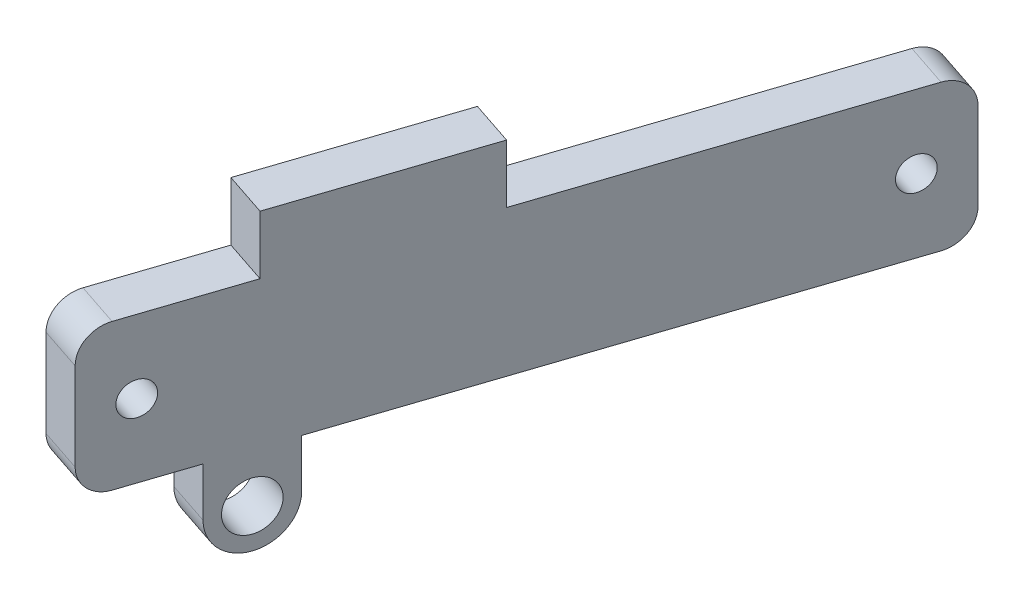
ISO-10303-21;
HEADER;
FILE_DESCRIPTION(('STEP AP214'),'2;1');
FILE_NAME('part.step','',(''),(''),'','','');
FILE_SCHEMA(('AUTOMOTIVE_DESIGN { 1 0 10303 214 1 1 1 1 }'));
ENDSEC;
DATA;
#1=APPLICATION_CONTEXT('core data for automotive mechanical design processes');
#2=APPLICATION_PROTOCOL_DEFINITION('international standard','automotive_design',2000,#1);
#3=PRODUCT_CONTEXT('',#1,'mechanical');
#4=PRODUCT('Part','Part','',(#3));
#5=PRODUCT_RELATED_PRODUCT_CATEGORY('part','',(#4));
#6=PRODUCT_DEFINITION_FORMATION('','',#4);
#7=PRODUCT_DEFINITION_CONTEXT('part definition',#1,'design');
#8=PRODUCT_DEFINITION('design','',#6,#7);
#9=PRODUCT_DEFINITION_SHAPE('','',#8);
#10=(LENGTH_UNIT() NAMED_UNIT(*) SI_UNIT(.MILLI.,.METRE.));
#11=(NAMED_UNIT(*) PLANE_ANGLE_UNIT() SI_UNIT($,.RADIAN.));
#12=(NAMED_UNIT(*) SI_UNIT($,.STERADIAN.) SOLID_ANGLE_UNIT());
#13=UNCERTAINTY_MEASURE_WITH_UNIT(LENGTH_MEASURE(1.E-05),#10,'distance_accuracy_value','');
#14=(GEOMETRIC_REPRESENTATION_CONTEXT(3) GLOBAL_UNCERTAINTY_ASSIGNED_CONTEXT((#13)) GLOBAL_UNIT_ASSIGNED_CONTEXT((#10,
#11,#12)) REPRESENTATION_CONTEXT('',''));
#15=CARTESIAN_POINT('',(0.,0.,0.));
#16=DIRECTION('',(0.,0.,1.));
#17=DIRECTION('',(1.,0.,0.));
#18=AXIS2_PLACEMENT_3D('',#15,#16,#17);
#19=CARTESIAN_POINT('',(-42.954096208357,238.125,-71.1245443554342));
#20=DIRECTION('',(0.,1.,0.));
#21=DIRECTION('',(0.,0.,1.));
#22=AXIS2_PLACEMENT_3D('',#19,#20,#21);
#23=PLANE('',#22);
#24=DIRECTION('',(-0.948683298050514,0.,-0.316227766016838));
#25=VECTOR('',#24,1.);
#26=CARTESIAN_POINT('',(-6.08031467214316,238.125,-78.9137469854321));
#27=LINE('',#26,#25);
#28=CARTESIAN_POINT('',(-31.2378574774332,238.125,-87.2995945871955));
#29=VERTEX_POINT('',#28);
#30=CARTESIAN_POINT('',(-36.9299572657363,238.125,-89.1969611832965));
#31=VERTEX_POINT('',#30);
#32=EDGE_CURVE('E50',#29,#31,#27,.T.);
#33=ORIENTED_EDGE('',*,*,#32,.T.);
#34=DIRECTION('',(-0.316227766016838,0.,0.948683298050514));
#35=VECTOR('',#34,1.);
#36=CARTESIAN_POINT('',(-42.954096208357,238.125,-71.1245443554342));
#37=LINE('',#36,#35);
#38=CARTESIAN_POINT('',(-41.7492684198329,238.125,-74.7390277210066));
#39=VERTEX_POINT('',#38);
#40=EDGE_CURVE('E240',#31,#39,#37,.T.);
#41=ORIENTED_EDGE('',*,*,#40,.T.);
#42=DIRECTION('',(0.948683298050514,0.,0.316227766016838));
#43=VECTOR('',#42,1.);
#44=CARTESIAN_POINT('',(-41.7492684198329,238.125,-74.7390277210066));
#45=LINE('',#44,#43);
#46=CARTESIAN_POINT('',(-36.0571686315298,238.125,-72.8416611249056));
#47=VERTEX_POINT('',#46);
#48=EDGE_CURVE('E283',#39,#47,#45,.T.);
#49=ORIENTED_EDGE('',*,*,#48,.T.);
#50=DIRECTION('',(-0.316227766016838,0.,0.948683298050514));
#51=VECTOR('',#50,1.);
#52=CARTESIAN_POINT('',(-37.2619964200539,238.125,-69.2271777593332));
#53=LINE('',#52,#51);
#54=EDGE_CURVE('E253',#29,#47,#53,.T.);
#55=ORIENTED_EDGE('',*,*,#54,.F.);
#56=EDGE_LOOP('',(#33,#41,#49,#55));
#57=FACE_BOUND('',#56,.T.);
#58=ADVANCED_FACE('F35',(#57),#23,.T.);
#59=CARTESIAN_POINT('',(-42.954096208357,219.075,-71.1245443554342));
#60=DIRECTION('',(0.,-1.,0.));
#61=DIRECTION('',(0.,0.,-1.));
#62=AXIS2_PLACEMENT_3D('',#59,#60,#61);
#63=PLANE('',#62);
#64=DIRECTION('',(-0.948683298050514,0.,-0.316227766016838));
#65=VECTOR('',#64,1.);
#66=CARTESIAN_POINT('',(-18.5872525514053,219.075,-76.8912501430432));
#67=LINE('',#66,#65);
#68=CARTESIAN_POINT('',(-33.0953003180761,219.075,-81.7272660652668));
#69=VERTEX_POINT('',#68);
#70=CARTESIAN_POINT('',(-38.7874001063791,219.075,-83.6246326613679));
#71=VERTEX_POINT('',#70);
#72=EDGE_CURVE('E209',#69,#71,#67,.T.);
#73=ORIENTED_EDGE('',*,*,#72,.F.);
#74=DIRECTION('',(0.316227766016838,0.,-0.948683298050514));
#75=VECTOR('',#74,1.);
#76=CARTESIAN_POINT('',(-37.2619964200539,219.075,-69.2271777593332));
#77=LINE('',#76,#75);
#78=CARTESIAN_POINT('',(-36.0571686315298,219.075,-72.8416611249056));
#79=VERTEX_POINT('',#78);
#80=EDGE_CURVE('E247',#79,#69,#77,.T.);
#81=ORIENTED_EDGE('',*,*,#80,.F.);
#82=DIRECTION('',(0.948683298050514,0.,0.316227766016838));
#83=VECTOR('',#82,1.);
#84=CARTESIAN_POINT('',(-41.7492684198329,219.075,-74.7390277210066));
#85=LINE('',#84,#83);
#86=CARTESIAN_POINT('',(-41.7492684198329,219.075,-74.7390277210066));
#87=VERTEX_POINT('',#86);
#88=EDGE_CURVE('E243',#79,#87,#85,.F.);
#89=ORIENTED_EDGE('',*,*,#88,.T.);
#90=DIRECTION('',(0.316227766016838,0.,-0.948683298050514));
#91=VECTOR('',#90,1.);
#92=CARTESIAN_POINT('',(-42.954096208357,219.075,-71.1245443554342));
#93=LINE('',#92,#91);
#94=EDGE_CURVE('E234',#87,#71,#93,.T.);
#95=ORIENTED_EDGE('',*,*,#94,.T.);
#96=EDGE_LOOP('',(#73,#81,#89,#95));
#97=FACE_BOUND('',#96,.T.);
#98=ADVANCED_FACE('F319',(#97),#63,.T.);
#99=CARTESIAN_POINT('',(-42.954096208357,238.125,-71.1245443554342));
#100=DIRECTION('',(-0.316227766016838,0.,0.948683298050514));
#101=DIRECTION('',(0.948683298050514,0.,0.316227766016838));
#102=AXIS2_PLACEMENT_3D('',#99,#100,#101);
#103=PLANE('',#102);
#104=DIRECTION('',(0.,-1.,0.));
#105=VECTOR('',#104,1.);
#106=CARTESIAN_POINT('',(-42.954096208357,238.125,-71.1245443554342));
#107=LINE('',#106,#105);
#108=CARTESIAN_POINT('',(-42.954096208357,234.315,-71.1245443554342));
#109=VERTEX_POINT('',#108);
#110=CARTESIAN_POINT('',(-42.954096208357,222.885,-71.1245443554342));
#111=VERTEX_POINT('',#110);
#112=EDGE_CURVE('E229',#109,#111,#107,.T.);
#113=ORIENTED_EDGE('',*,*,#112,.T.);
#114=DIRECTION('',(0.948683298050514,0.,0.316227766016838));
#115=VECTOR('',#114,1.);
#116=CARTESIAN_POINT('',(-42.954096208357,222.885,-71.1245443554342));
#117=LINE('',#116,#115);
#118=CARTESIAN_POINT('',(-37.2619964200539,222.885,-69.2271777593332));
#119=VERTEX_POINT('',#118);
#120=EDGE_CURVE('E11',#111,#119,#117,.T.);
#121=ORIENTED_EDGE('',*,*,#120,.T.);
#122=DIRECTION('',(0.,-1.,0.));
#123=VECTOR('',#122,1.);
#124=CARTESIAN_POINT('',(-37.2619964200539,238.125,-69.2271777593332));
#125=LINE('',#124,#123);
#126=CARTESIAN_POINT('',(-37.2619964200539,234.315,-69.2271777593332));
#127=VERTEX_POINT('',#126);
#128=EDGE_CURVE('E226',#127,#119,#125,.T.);
#129=ORIENTED_EDGE('',*,*,#128,.F.);
#130=DIRECTION('',(0.948683298050514,0.,0.316227766016838));
#131=VECTOR('',#130,1.);
#132=CARTESIAN_POINT('',(-42.954096208357,234.315,-71.1245443554342));
#133=LINE('',#132,#131);
#134=EDGE_CURVE('E43',#127,#109,#133,.F.);
#135=ORIENTED_EDGE('',*,*,#134,.T.);
#136=EDGE_LOOP('',(#113,#121,#129,#135));
#137=FACE_BOUND('',#136,.T.);
#138=ADVANCED_FACE('F291',(#137),#103,.T.);
#139=DIRECTION('',(-0.948683298050514,0.,-0.316227766016838));
#140=VECTOR('',#139,1.);
#141=CARTESIAN_POINT('',(1.95187058468453,238.125,-103.010302755915));
#142=LINE('',#141,#140);
#143=CARTESIAN_POINT('',(-23.2056722206055,238.125,-111.396150357679));
#144=VERTEX_POINT('',#143);
#145=CARTESIAN_POINT('',(-28.8977720089086,238.125,-113.29351695378));
#146=VERTEX_POINT('',#145);
#147=EDGE_CURVE('E165',#144,#146,#142,.T.);
#148=ORIENTED_EDGE('',*,*,#147,.F.);
#149=CARTESIAN_POINT('',(-9.05073158016573,238.125,-153.860972278998));
#150=VERTEX_POINT('',#149);
#151=EDGE_CURVE('E233',#150,#144,#53,.T.);
#152=ORIENTED_EDGE('',*,*,#151,.F.);
#153=DIRECTION('',(0.948683298050514,0.,0.316227766016838));
#154=VECTOR('',#153,1.);
#155=CARTESIAN_POINT('',(-14.7428313684688,238.125,-155.758338875099));
#156=LINE('',#155,#154);
#157=CARTESIAN_POINT('',(-14.7428313684688,238.125,-155.758338875099));
#158=VERTEX_POINT('',#157);
#159=EDGE_CURVE('E286',#150,#158,#156,.F.);
#160=ORIENTED_EDGE('',*,*,#159,.T.);
#161=EDGE_CURVE('E241',#158,#146,#37,.T.);
#162=ORIENTED_EDGE('',*,*,#161,.T.);
#163=EDGE_LOOP('',(#148,#152,#160,#162));
#164=FACE_BOUND('',#163,.T.);
#165=ADVANCED_FACE('F321',(#164),#23,.T.);
#166=CARTESIAN_POINT('',(-13.5380035799447,238.125,-159.372822240671));
#167=DIRECTION('',(0.316227766016838,0.,-0.948683298050514));
#168=DIRECTION('',(-0.948683298050514,0.,-0.316227766016838));
#169=AXIS2_PLACEMENT_3D('',#166,#167,#168);
#170=PLANE('',#169);
#171=DIRECTION('',(0.,1.,0.));
#172=VECTOR('',#171,1.);
#173=CARTESIAN_POINT('',(-7.84590379164158,238.125,-157.47545564457));
#174=LINE('',#173,#172);
#175=CARTESIAN_POINT('',(-7.84590379164158,222.885,-157.47545564457));
#176=VERTEX_POINT('',#175);
#177=CARTESIAN_POINT('',(-7.84590379164158,234.315,-157.47545564457));
#178=VERTEX_POINT('',#177);
#179=EDGE_CURVE('E250',#176,#178,#174,.T.);
#180=ORIENTED_EDGE('',*,*,#179,.F.);
#181=DIRECTION('',(0.948683298050514,0.,0.316227766016838));
#182=VECTOR('',#181,1.);
#183=CARTESIAN_POINT('',(-13.5380035799447,222.885,-159.372822240671));
#184=LINE('',#183,#182);
#185=CARTESIAN_POINT('',(-13.5380035799447,222.885,-159.372822240671));
#186=VERTEX_POINT('',#185);
#187=EDGE_CURVE('E271',#176,#186,#184,.F.);
#188=ORIENTED_EDGE('',*,*,#187,.T.);
#189=DIRECTION('',(0.,1.,0.));
#190=VECTOR('',#189,1.);
#191=CARTESIAN_POINT('',(-13.5380035799447,238.125,-159.372822240671));
#192=LINE('',#191,#190);
#193=CARTESIAN_POINT('',(-13.5380035799447,234.315,-159.372822240671));
#194=VERTEX_POINT('',#193);
#195=EDGE_CURVE('E237',#186,#194,#192,.T.);
#196=ORIENTED_EDGE('',*,*,#195,.T.);
#197=DIRECTION('',(0.948683298050514,0.,0.316227766016838));
#198=VECTOR('',#197,1.);
#199=CARTESIAN_POINT('',(-13.5380035799447,234.315,-159.372822240671));
#200=LINE('',#199,#198);
#201=EDGE_CURVE('E268',#194,#178,#200,.T.);
#202=ORIENTED_EDGE('',*,*,#201,.T.);
#203=EDGE_LOOP('',(#180,#188,#196,#202));
#204=FACE_BOUND('',#203,.T.);
#205=ADVANCED_FACE('F332',(#204),#170,.T.);
#206=DIRECTION('',(-0.948683298050514,0.,-0.316227766016838));
#207=VECTOR('',#206,1.);
#208=CARTESIAN_POINT('',(-15.3743784486742,219.075,-86.5298724512365));
#209=LINE('',#208,#207);
#210=CARTESIAN_POINT('',(-29.882426215345,219.075,-91.3658883734601));
#211=VERTEX_POINT('',#210);
#212=CARTESIAN_POINT('',(-35.5745260036481,219.075,-93.2632549695611));
#213=VERTEX_POINT('',#212);
#214=EDGE_CURVE('E58',#211,#213,#209,.T.);
#215=ORIENTED_EDGE('',*,*,#214,.T.);
#216=CARTESIAN_POINT('',(-14.7428313684688,219.075,-155.758338875099));
#217=VERTEX_POINT('',#216);
#218=EDGE_CURVE('E232',#213,#217,#93,.T.);
#219=ORIENTED_EDGE('',*,*,#218,.T.);
#220=DIRECTION('',(0.948683298050514,0.,0.316227766016838));
#221=VECTOR('',#220,1.);
#222=CARTESIAN_POINT('',(-14.7428313684688,219.075,-155.758338875099));
#223=LINE('',#222,#221);
#224=CARTESIAN_POINT('',(-9.05073158016572,219.075,-153.860972278998));
#225=VERTEX_POINT('',#224);
#226=EDGE_CURVE('E257',#217,#225,#223,.T.);
#227=ORIENTED_EDGE('',*,*,#226,.T.);
#228=EDGE_CURVE('E246',#211,#225,#77,.T.);
#229=ORIENTED_EDGE('',*,*,#228,.F.);
#230=EDGE_LOOP('',(#215,#219,#227,#229));
#231=FACE_BOUND('',#230,.T.);
#232=ADVANCED_FACE('F329',(#231),#63,.T.);
#233=CARTESIAN_POINT('',(-59.9960498941516,0.,-19.9986832980505));
#234=DIRECTION('',(0.948683298050514,0.,0.316227766016838));
#235=DIRECTION('',(0.316227766016838,0.,-0.948683298050514));
#236=AXIS2_PLACEMENT_3D('',#233,#234,#235);
#237=PLANE('',#236);
#238=CARTESIAN_POINT('',(-40.9460498941516,228.6,-77.1486832980505));
#239=DIRECTION('',(0.948683298050514,0.,0.316227766016838));
#240=DIRECTION('',(0.316227766016838,0.,-0.948683298050514));
#241=AXIS2_PLACEMENT_3D('',#238,#239,#240);
#242=CIRCLE('',#241,2.15265000000001);
#243=CARTESIAN_POINT('',(-40.2653221936354,228.6,-79.190866399599));
#244=VERTEX_POINT('',#243);
#245=EDGE_CURVE('E217',#244,#244,#242,.T.);
#246=ORIENTED_EDGE('',*,*,#245,.T.);
#247=EDGE_LOOP('',(#246));
#248=FACE_BOUND('',#247,.T.);
#249=CARTESIAN_POINT('',(-15.5460498941516,228.6,-153.348683298051));
#250=DIRECTION('',(0.948683298050514,0.,0.316227766016838));
#251=DIRECTION('',(0.316227766016838,0.,-0.948683298050514));
#252=AXIS2_PLACEMENT_3D('',#249,#250,#251);
#253=CIRCLE('',#252,2.15265);
#254=CARTESIAN_POINT('',(-14.8653221936354,228.6,-155.390866399599));
#255=VERTEX_POINT('',#254);
#256=EDGE_CURVE('E223',#255,#255,#253,.T.);
#257=ORIENTED_EDGE('',*,*,#256,.T.);
#258=EDGE_LOOP('',(#257));
#259=FACE_BOUND('',#258,.T.);
#260=ORIENTED_EDGE('',*,*,#195,.F.);
#261=CARTESIAN_POINT('',(-14.7428313684688,222.885,-155.758338875099));
#262=DIRECTION('',(0.948683298050514,0.,0.316227766016838));
#263=DIRECTION('',(0.316227766016838,0.,-0.948683298050514));
#264=AXIS2_PLACEMENT_3D('',#261,#262,#263);
#265=CIRCLE('',#264,3.81);
#266=EDGE_CURVE('E280',#186,#217,#265,.F.);
#267=ORIENTED_EDGE('',*,*,#266,.T.);
#268=ORIENTED_EDGE('',*,*,#218,.F.);
#269=DIRECTION('',(0.,-1.,0.));
#270=VECTOR('',#269,1.);
#271=CARTESIAN_POINT('',(-35.5745260036481,219.075,-93.2632549695611));
#272=LINE('',#271,#270);
#273=CARTESIAN_POINT('',(-35.5745260036481,212.725,-93.2632549695611));
#274=VERTEX_POINT('',#273);
#275=EDGE_CURVE('E194',#213,#274,#272,.T.);
#276=ORIENTED_EDGE('',*,*,#275,.T.);
#277=CARTESIAN_POINT('',(-37.1809630550136,212.725,-88.4439438154645));
#278=DIRECTION('',(-0.948683298050514,0.,-0.316227766016838));
#279=DIRECTION('',(-0.316227766016838,0.,0.948683298050514));
#280=AXIS2_PLACEMENT_3D('',#277,#278,#279);
#281=CIRCLE('',#280,5.08000000000001);
#282=CARTESIAN_POINT('',(-38.7874001063791,212.725,-83.6246326613679));
#283=VERTEX_POINT('',#282);
#284=EDGE_CURVE('E191',#274,#283,#281,.T.);
#285=ORIENTED_EDGE('',*,*,#284,.T.);
#286=DIRECTION('',(0.,1.,0.));
#287=VECTOR('',#286,1.);
#288=CARTESIAN_POINT('',(-38.7874001063791,212.725,-83.6246326613679));
#289=LINE('',#288,#287);
#290=EDGE_CURVE('E187',#283,#71,#289,.T.);
#291=ORIENTED_EDGE('',*,*,#290,.T.);
#292=ORIENTED_EDGE('',*,*,#94,.F.);
#293=CARTESIAN_POINT('',(-41.7492684198329,222.885,-74.7390277210066));
#294=DIRECTION('',(0.948683298050514,0.,0.316227766016838));
#295=DIRECTION('',(0.316227766016838,0.,-0.948683298050514));
#296=AXIS2_PLACEMENT_3D('',#293,#294,#295);
#297=CIRCLE('',#296,3.81);
#298=EDGE_CURVE('E276',#87,#111,#297,.F.);
#299=ORIENTED_EDGE('',*,*,#298,.T.);
#300=ORIENTED_EDGE('',*,*,#112,.F.);
#301=CARTESIAN_POINT('',(-41.7492684198329,234.315,-74.7390277210066));
#302=DIRECTION('',(0.948683298050514,0.,0.316227766016838));
#303=DIRECTION('',(0.316227766016838,0.,-0.948683298050514));
#304=AXIS2_PLACEMENT_3D('',#301,#302,#303);
#305=CIRCLE('',#304,3.81);
#306=EDGE_CURVE('E273',#109,#39,#305,.F.);
#307=ORIENTED_EDGE('',*,*,#306,.T.);
#308=ORIENTED_EDGE('',*,*,#40,.F.);
#309=DIRECTION('',(0.,1.,0.));
#310=VECTOR('',#309,1.);
#311=CARTESIAN_POINT('',(-36.9299572657363,238.125,-89.1969611832965));
#312=LINE('',#311,#310);
#313=CARTESIAN_POINT('',(-36.9299572657363,245.745,-89.1969611832965));
#314=VERTEX_POINT('',#313);
#315=EDGE_CURVE('E169',#31,#314,#312,.T.);
#316=ORIENTED_EDGE('',*,*,#315,.T.);
#317=DIRECTION('',(0.316227766016838,0.,-0.948683298050514));
#318=VECTOR('',#317,1.);
#319=CARTESIAN_POINT('',(-28.8977720089086,245.745,-113.29351695378));
#320=LINE('',#319,#318);
#321=CARTESIAN_POINT('',(-28.8977720089086,245.745,-113.29351695378));
#322=VERTEX_POINT('',#321);
#323=EDGE_CURVE('E156',#314,#322,#320,.T.);
#324=ORIENTED_EDGE('',*,*,#323,.T.);
#325=DIRECTION('',(0.,-1.,0.));
#326=VECTOR('',#325,1.);
#327=CARTESIAN_POINT('',(-28.8977720089086,238.125,-113.29351695378));
#328=LINE('',#327,#326);
#329=EDGE_CURVE('E162',#322,#146,#328,.T.);
#330=ORIENTED_EDGE('',*,*,#329,.T.);
#331=ORIENTED_EDGE('',*,*,#161,.F.);
#332=CARTESIAN_POINT('',(-14.7428313684688,234.315,-155.758338875099));
#333=DIRECTION('',(0.948683298050514,0.,0.316227766016838));
#334=DIRECTION('',(0.316227766016838,0.,-0.948683298050514));
#335=AXIS2_PLACEMENT_3D('',#332,#333,#334);
#336=CIRCLE('',#335,3.81);
#337=EDGE_CURVE('E278',#158,#194,#336,.F.);
#338=ORIENTED_EDGE('',*,*,#337,.T.);
#339=EDGE_LOOP('',(#260,#267,#268,#276,#285,#291,#292,#299,#300,#307,#308,#316,#324,#330,#331,#338));
#340=FACE_BOUND('',#339,.T.);
#341=CARTESIAN_POINT('',(-37.1809630550136,212.725,-88.4439438154645));
#342=DIRECTION('',(-0.948683298050514,0.,-0.316227766016838));
#343=DIRECTION('',(-0.316227766016838,0.,0.948683298050514));
#344=AXIS2_PLACEMENT_3D('',#341,#342,#343);
#345=CIRCLE('',#344,3.17499999999998);
#346=CARTESIAN_POINT('',(-38.1849862121171,212.725,-85.4318743441541));
#347=VERTEX_POINT('',#346);
#348=EDGE_CURVE('E197',#347,#347,#345,.T.);
#349=ORIENTED_EDGE('',*,*,#348,.F.);
#350=EDGE_LOOP('',(#349));
#351=FACE_BOUND('',#350,.T.);
#352=ADVANCED_FACE('F173',(#248,#259,#340,#351),#237,.F.);
#353=CARTESIAN_POINT('',(-54.3039501058485,0.,-18.1013167019495));
#354=DIRECTION('',(0.948683298050514,0.,0.316227766016838));
#355=DIRECTION('',(0.316227766016838,0.,-0.948683298050514));
#356=AXIS2_PLACEMENT_3D('',#353,#354,#355);
#357=PLANE('',#356);
#358=CARTESIAN_POINT('',(-35.2539501058485,228.6,-75.2513167019495));
#359=DIRECTION('',(0.948683298050514,0.,0.316227766016838));
#360=DIRECTION('',(0.316227766016838,0.,-0.948683298050514));
#361=AXIS2_PLACEMENT_3D('',#358,#359,#360);
#362=CIRCLE('',#361,2.15265000000001);
#363=CARTESIAN_POINT('',(-34.5732224053323,228.6,-77.2934998034979));
#364=VERTEX_POINT('',#363);
#365=EDGE_CURVE('E203',#364,#364,#362,.T.);
#366=ORIENTED_EDGE('',*,*,#365,.F.);
#367=EDGE_LOOP('',(#366));
#368=FACE_BOUND('',#367,.T.);
#369=CARTESIAN_POINT('',(-9.8539501058485,228.6,-151.451316701949));
#370=DIRECTION('',(0.948683298050514,0.,0.316227766016838));
#371=DIRECTION('',(0.316227766016838,0.,-0.948683298050514));
#372=AXIS2_PLACEMENT_3D('',#369,#370,#371);
#373=CIRCLE('',#372,2.15265);
#374=CARTESIAN_POINT('',(-9.17322240533235,228.6,-153.493499803498));
#375=VERTEX_POINT('',#374);
#376=EDGE_CURVE('E220',#375,#375,#373,.T.);
#377=ORIENTED_EDGE('',*,*,#376,.F.);
#378=EDGE_LOOP('',(#377));
#379=FACE_BOUND('',#378,.T.);
#380=ORIENTED_EDGE('',*,*,#80,.T.);
#381=DIRECTION('',(0.,1.,0.));
#382=VECTOR('',#381,1.);
#383=CARTESIAN_POINT('',(-33.0953003180761,212.725,-81.7272660652668));
#384=LINE('',#383,#382);
#385=CARTESIAN_POINT('',(-33.0953003180761,212.725,-81.7272660652668));
#386=VERTEX_POINT('',#385);
#387=EDGE_CURVE('E207',#386,#69,#384,.T.);
#388=ORIENTED_EDGE('',*,*,#387,.F.);
#389=CARTESIAN_POINT('',(-31.4888632667105,212.725,-86.5465772193634));
#390=DIRECTION('',(0.948683298050514,0.,0.316227766016838));
#391=DIRECTION('',(0.316227766016838,0.,-0.948683298050514));
#392=AXIS2_PLACEMENT_3D('',#389,#390,#391);
#393=CIRCLE('',#392,5.08000000000001);
#394=CARTESIAN_POINT('',(-29.882426215345,212.725,-91.3658883734601));
#395=VERTEX_POINT('',#394);
#396=EDGE_CURVE('E210',#395,#386,#393,.F.);
#397=ORIENTED_EDGE('',*,*,#396,.F.);
#398=DIRECTION('',(0.,-1.,0.));
#399=VECTOR('',#398,1.);
#400=CARTESIAN_POINT('',(-29.882426215345,219.075,-91.3658883734601));
#401=LINE('',#400,#399);
#402=EDGE_CURVE('E204',#211,#395,#401,.T.);
#403=ORIENTED_EDGE('',*,*,#402,.F.);
#404=ORIENTED_EDGE('',*,*,#228,.T.);
#405=CARTESIAN_POINT('',(-9.05073158016575,222.885,-153.860972278998));
#406=DIRECTION('',(0.948683298050514,0.,0.316227766016838));
#407=DIRECTION('',(0.316227766016838,0.,-0.948683298050514));
#408=AXIS2_PLACEMENT_3D('',#405,#406,#407);
#409=CIRCLE('',#408,3.81);
#410=EDGE_CURVE('E266',#225,#176,#409,.T.);
#411=ORIENTED_EDGE('',*,*,#410,.T.);
#412=ORIENTED_EDGE('',*,*,#179,.T.);
#413=CARTESIAN_POINT('',(-9.05073158016575,234.315,-153.860972278998));
#414=DIRECTION('',(0.948683298050514,0.,0.316227766016838));
#415=DIRECTION('',(0.316227766016838,0.,-0.948683298050514));
#416=AXIS2_PLACEMENT_3D('',#413,#414,#415);
#417=CIRCLE('',#416,3.81);
#418=EDGE_CURVE('E264',#178,#150,#417,.T.);
#419=ORIENTED_EDGE('',*,*,#418,.T.);
#420=ORIENTED_EDGE('',*,*,#151,.T.);
#421=DIRECTION('',(0.,-1.,0.));
#422=VECTOR('',#421,1.);
#423=CARTESIAN_POINT('',(-23.2056722206055,238.125,-111.396150357679));
#424=LINE('',#423,#422);
#425=CARTESIAN_POINT('',(-23.2056722206055,245.745,-111.396150357679));
#426=VERTEX_POINT('',#425);
#427=EDGE_CURVE('E159',#426,#144,#424,.T.);
#428=ORIENTED_EDGE('',*,*,#427,.F.);
#429=DIRECTION('',(0.316227766016838,0.,-0.948683298050514));
#430=VECTOR('',#429,1.);
#431=CARTESIAN_POINT('',(-23.2056722206055,245.745,-111.396150357679));
#432=LINE('',#431,#430);
#433=CARTESIAN_POINT('',(-31.2378574774332,245.745,-87.2995945871955));
#434=VERTEX_POINT('',#433);
#435=EDGE_CURVE('E157',#434,#426,#432,.T.);
#436=ORIENTED_EDGE('',*,*,#435,.F.);
#437=DIRECTION('',(0.,1.,0.));
#438=VECTOR('',#437,1.);
#439=CARTESIAN_POINT('',(-31.2378574774332,238.125,-87.2995945871955));
#440=LINE('',#439,#438);
#441=EDGE_CURVE('E177',#29,#434,#440,.T.);
#442=ORIENTED_EDGE('',*,*,#441,.F.);
#443=ORIENTED_EDGE('',*,*,#54,.T.);
#444=CARTESIAN_POINT('',(-36.0571686315298,234.315,-72.8416611249056));
#445=DIRECTION('',(0.948683298050514,0.,0.316227766016838));
#446=DIRECTION('',(0.316227766016838,0.,-0.948683298050514));
#447=AXIS2_PLACEMENT_3D('',#444,#445,#446);
#448=CIRCLE('',#447,3.81);
#449=EDGE_CURVE('E260',#47,#127,#448,.T.);
#450=ORIENTED_EDGE('',*,*,#449,.T.);
#451=ORIENTED_EDGE('',*,*,#128,.T.);
#452=CARTESIAN_POINT('',(-36.0571686315298,222.885,-72.8416611249056));
#453=DIRECTION('',(0.948683298050514,0.,0.316227766016838));
#454=DIRECTION('',(0.316227766016838,0.,-0.948683298050514));
#455=AXIS2_PLACEMENT_3D('',#452,#453,#454);
#456=CIRCLE('',#455,3.81);
#457=EDGE_CURVE('E262',#119,#79,#456,.T.);
#458=ORIENTED_EDGE('',*,*,#457,.T.);
#459=EDGE_LOOP('',(#380,#388,#397,#403,#404,#411,#412,#419,#420,#428,#436,#442,#443,#450,#451,#458));
#460=FACE_BOUND('',#459,.T.);
#461=CARTESIAN_POINT('',(-31.4888632667105,212.725,-86.5465772193634));
#462=DIRECTION('',(0.948683298050514,0.,0.316227766016838));
#463=DIRECTION('',(0.316227766016838,0.,-0.948683298050514));
#464=AXIS2_PLACEMENT_3D('',#461,#462,#463);
#465=CIRCLE('',#464,3.17499999999998);
#466=CARTESIAN_POINT('',(-30.4848401096071,212.725,-89.5586466906738));
#467=VERTEX_POINT('',#466);
#468=EDGE_CURVE('E190',#467,#467,#465,.F.);
#469=ORIENTED_EDGE('',*,*,#468,.T.);
#470=EDGE_LOOP('',(#469));
#471=FACE_BOUND('',#470,.T.);
#472=ADVANCED_FACE('F302',(#368,#379,#460,#471),#357,.T.);
#473=CARTESIAN_POINT('',(-15.5460498941516,228.6,-153.348683298051));
#474=DIRECTION('',(0.948683298050514,0.,0.316227766016838));
#475=DIRECTION('',(0.316227766016838,0.,-0.948683298050514));
#476=AXIS2_PLACEMENT_3D('',#473,#474,#475);
#477=CYLINDRICAL_SURFACE('',#476,2.15265);
#478=CARTESIAN_POINT('',(-14.8653221936354,228.6,-155.390866399599));
#479=CARTESIAN_POINT('',(-14.8060294875073,228.6,-155.371102164223));
#480=CARTESIAN_POINT('',(-14.7467367813791,228.6,-155.351337928847));
#481=CARTESIAN_POINT('',(-14.6281513691228,228.6,-155.311809458095));
#482=CARTESIAN_POINT('',(-14.5688586629946,228.6,-155.292045222719));
#483=CARTESIAN_POINT('',(-14.4502732507383,228.6,-155.252516751967));
#484=CARTESIAN_POINT('',(-14.3909805446102,228.6,-155.232752516591));
#485=CARTESIAN_POINT('',(-14.2723951323539,228.6,-155.193224045838));
#486=CARTESIAN_POINT('',(-14.2131024262257,228.6,-155.173459810462));
#487=CARTESIAN_POINT('',(-14.0945170139694,228.6,-155.13393133971));
#488=CARTESIAN_POINT('',(-14.0352243078412,228.6,-155.114167104334));
#489=CARTESIAN_POINT('',(-13.9166388955849,228.6,-155.074638633582));
#490=CARTESIAN_POINT('',(-13.8573461894568,228.6,-155.054874398206));
#491=CARTESIAN_POINT('',(-13.7387607772004,228.6,-155.015345927454));
#492=CARTESIAN_POINT('',(-13.6794680710723,228.6,-154.995581692078));
#493=CARTESIAN_POINT('',(-13.560882658816,228.6,-154.956053221326));
#494=CARTESIAN_POINT('',(-13.5015899526878,228.6,-154.93628898595));
#495=CARTESIAN_POINT('',(-13.3830045404315,228.6,-154.896760515198));
#496=CARTESIAN_POINT('',(-13.3237118343033,228.6,-154.876996279822));
#497=CARTESIAN_POINT('',(-13.205126422047,228.6,-154.837467809069));
#498=CARTESIAN_POINT('',(-13.1458337159189,228.6,-154.817703573693));
#499=CARTESIAN_POINT('',(-13.0272483036626,228.6,-154.778175102941));
#500=CARTESIAN_POINT('',(-12.9679555975344,228.6,-154.758410867565));
#501=CARTESIAN_POINT('',(-12.8493701852781,228.6,-154.718882396813));
#502=CARTESIAN_POINT('',(-12.7900774791499,228.6,-154.699118161437));
#503=CARTESIAN_POINT('',(-12.6714920668936,228.6,-154.659589690685));
#504=CARTESIAN_POINT('',(-12.6121993607655,228.6,-154.639825455309));
#505=CARTESIAN_POINT('',(-12.4936139485092,228.6,-154.600296984557));
#506=CARTESIAN_POINT('',(-12.434321242381,228.6,-154.580532749181));
#507=CARTESIAN_POINT('',(-12.3157358301247,228.6,-154.541004278429));
#508=CARTESIAN_POINT('',(-12.2564431239965,228.6,-154.521240043053));
#509=CARTESIAN_POINT('',(-12.1378577117402,228.6,-154.481711572301));
#510=CARTESIAN_POINT('',(-12.078565005612,228.6,-154.461947336925));
#511=CARTESIAN_POINT('',(-11.9599795933557,228.6,-154.422418866172));
#512=CARTESIAN_POINT('',(-11.9006868872276,228.6,-154.402654630796));
#513=CARTESIAN_POINT('',(-11.7821014749713,228.6,-154.363126160044));
#514=CARTESIAN_POINT('',(-11.7228087688431,228.6,-154.343361924668));
#515=CARTESIAN_POINT('',(-11.6042233565868,228.6,-154.303833453916));
#516=CARTESIAN_POINT('',(-11.5449306504586,228.6,-154.28406921854));
#517=CARTESIAN_POINT('',(-11.4263452382023,228.6,-154.244540747788));
#518=CARTESIAN_POINT('',(-11.3670525320742,228.6,-154.224776512412));
#519=CARTESIAN_POINT('',(-11.2484671198178,228.6,-154.18524804166));
#520=CARTESIAN_POINT('',(-11.1891744136897,228.6,-154.165483806284));
#521=CARTESIAN_POINT('',(-11.0705890014334,228.6,-154.125955335532));
#522=CARTESIAN_POINT('',(-11.0112962953052,228.6,-154.106191100156));
#523=CARTESIAN_POINT('',(-10.8927108830489,228.6,-154.066662629403));
#524=CARTESIAN_POINT('',(-10.8334181769207,228.6,-154.046898394027));
#525=CARTESIAN_POINT('',(-10.7148327646644,228.6,-154.007369923275));
#526=CARTESIAN_POINT('',(-10.6555400585363,228.6,-153.987605687899));
#527=CARTESIAN_POINT('',(-10.53695464628,228.6,-153.948077217147));
#528=CARTESIAN_POINT('',(-10.4776619401518,228.6,-153.928312981771));
#529=CARTESIAN_POINT('',(-10.3590765278955,228.6,-153.888784511019));
#530=CARTESIAN_POINT('',(-10.2997838217673,228.6,-153.869020275643));
#531=CARTESIAN_POINT('',(-10.181198409511,228.6,-153.829491804891));
#532=CARTESIAN_POINT('',(-10.1219057033829,228.6,-153.809727569515));
#533=CARTESIAN_POINT('',(-10.0033202911265,228.6,-153.770199098763));
#534=CARTESIAN_POINT('',(-9.94402758499839,228.6,-153.750434863387));
#535=CARTESIAN_POINT('',(-9.82544217274208,228.6,-153.710906392634));
#536=CARTESIAN_POINT('',(-9.76614946661392,228.6,-153.691142157258));
#537=CARTESIAN_POINT('',(-9.64756405435761,228.6,-153.651613686506));
#538=CARTESIAN_POINT('',(-9.58827134822945,228.6,-153.63184945113));
#539=CARTESIAN_POINT('',(-9.46968593597314,228.6,-153.592320980378));
#540=CARTESIAN_POINT('',(-9.41039322984498,228.6,-153.572556745002));
#541=CARTESIAN_POINT('',(-9.29180781758866,228.6,-153.53302827425));
#542=CARTESIAN_POINT('',(-9.2325151114605,228.6,-153.513264038874));
#543=CARTESIAN_POINT('',(-9.17322240533235,228.6,-153.493499803498));
#544=B_SPLINE_CURVE_WITH_KNOTS('',3,(#478,#479,#480,#481,#482,#483,#484,#485,#486,#487,#488,
#489,#490,#491,#492,#493,#494,#495,#496,#497,#498,#499,#500,#501,#502,#503,#504,#505,#506,#507,
#508,#509,#510,#511,#512,#513,#514,#515,#516,#517,#518,#519,#520,#521,#522,#523,#524,#525,#526,
#527,#528,#529,#530,#531,#532,#533,#534,#535,#536,#537,#538,#539,#540,#541,#542,#543),
.UNSPECIFIED.,.F.,.F.,(4,2,2,2,2,2,2,2,2,2,2,2,2,2,2,2,2,2,2,2,2,2,2,2,2,2,2,2,2,2,2,2,4),(0.,
0.187499999999995,0.375,0.562499999999996,0.750000000000002,0.937499999999996,1.125,1.3125,1.5,
1.6875,1.875,2.0625,2.25,2.4375,2.625,2.8125,3.,3.1875,3.375,3.5625,3.75,3.9375,4.125,4.3125,
4.5,4.6875,4.875,5.0625,5.25,5.4375,5.62500000000001,5.8125,6.00000000000001),.UNSPECIFIED.);
#545=EDGE_CURVE('BSEAM388',#255,#375,#544,.T.);
#546=ORIENTED_EDGE('',*,*,#256,.F.);
#547=ORIENTED_EDGE('',*,*,#376,.T.);
#548=ORIENTED_EDGE('',*,*,#545,.T.);
#549=ORIENTED_EDGE('',*,*,#545,.F.);
#550=EDGE_LOOP('',(#546,#548,#547,#549));
#551=FACE_BOUND('',#550,.T.);
#552=ADVANCED_FACE('F388',(#551),#477,.F.);
#553=CARTESIAN_POINT('',(-40.9460498941516,228.6,-77.1486832980505));
#554=DIRECTION('',(0.948683298050514,0.,0.316227766016838));
#555=DIRECTION('',(0.316227766016838,0.,-0.948683298050514));
#556=AXIS2_PLACEMENT_3D('',#553,#554,#555);
#557=CYLINDRICAL_SURFACE('',#556,2.15265000000001);
#558=CARTESIAN_POINT('',(-40.2653221936354,228.6,-79.190866399599));
#559=CARTESIAN_POINT('',(-40.2060294875073,228.6,-79.1711021642229));
#560=CARTESIAN_POINT('',(-40.1467367813791,228.6,-79.1513379288469));
#561=CARTESIAN_POINT('',(-40.0281513691228,228.6,-79.1118094580948));
#562=CARTESIAN_POINT('',(-39.9688586629946,228.6,-79.0920452227187));
#563=CARTESIAN_POINT('',(-39.8502732507383,228.6,-79.0525167519666));
#564=CARTESIAN_POINT('',(-39.7909805446102,228.6,-79.0327525165905));
#565=CARTESIAN_POINT('',(-39.6723951323538,228.6,-78.9932240458384));
#566=CARTESIAN_POINT('',(-39.6131024262257,228.6,-78.9734598104624));
#567=CARTESIAN_POINT('',(-39.4945170139694,228.6,-78.9339313397103));
#568=CARTESIAN_POINT('',(-39.4352243078412,228.6,-78.9141671043342));
#569=CARTESIAN_POINT('',(-39.3166388955849,228.6,-78.8746386335821));
#570=CARTESIAN_POINT('',(-39.2573461894568,228.6,-78.8548743982061));
#571=CARTESIAN_POINT('',(-39.1387607772004,228.6,-78.815345927454));
#572=CARTESIAN_POINT('',(-39.0794680710723,228.6,-78.7955816920779));
#573=CARTESIAN_POINT('',(-38.960882658816,228.6,-78.7560532213258));
#574=CARTESIAN_POINT('',(-38.9015899526878,228.6,-78.7362889859498));
#575=CARTESIAN_POINT('',(-38.7830045404315,228.6,-78.6967605151977));
#576=CARTESIAN_POINT('',(-38.7237118343033,228.6,-78.6769962798216));
#577=CARTESIAN_POINT('',(-38.605126422047,228.6,-78.6374678090695));
#578=CARTESIAN_POINT('',(-38.5458337159189,228.6,-78.6177035736934));
#579=CARTESIAN_POINT('',(-38.4272483036626,228.6,-78.5781751029413));
#580=CARTESIAN_POINT('',(-38.3679555975344,228.6,-78.5584108675653));
#581=CARTESIAN_POINT('',(-38.2493701852781,228.6,-78.5188823968132));
#582=CARTESIAN_POINT('',(-38.1900774791499,228.6,-78.4991181614371));
#583=CARTESIAN_POINT('',(-38.0714920668936,228.6,-78.459589690685));
#584=CARTESIAN_POINT('',(-38.0121993607655,228.6,-78.439825455309));
#585=CARTESIAN_POINT('',(-37.8936139485091,228.6,-78.4002969845569));
#586=CARTESIAN_POINT('',(-37.834321242381,228.6,-78.3805327491808));
#587=CARTESIAN_POINT('',(-37.7157358301247,228.6,-78.3410042784287));
#588=CARTESIAN_POINT('',(-37.6564431239965,228.6,-78.3212400430527));
#589=CARTESIAN_POINT('',(-37.5378577117402,228.6,-78.2817115723005));
#590=CARTESIAN_POINT('',(-37.478565005612,228.6,-78.2619473369245));
#591=CARTESIAN_POINT('',(-37.3599795933557,228.6,-78.2224188661724));
#592=CARTESIAN_POINT('',(-37.3006868872276,228.6,-78.2026546307963));
#593=CARTESIAN_POINT('',(-37.1821014749713,228.6,-78.1631261600442));
#594=CARTESIAN_POINT('',(-37.1228087688431,228.6,-78.1433619246682));
#595=CARTESIAN_POINT('',(-37.0042233565868,228.6,-78.1038334539161));
#596=CARTESIAN_POINT('',(-36.9449306504586,228.6,-78.08406921854));
#597=CARTESIAN_POINT('',(-36.8263452382023,228.6,-78.0445407477879));
#598=CARTESIAN_POINT('',(-36.7670525320742,228.6,-78.0247765124119));
#599=CARTESIAN_POINT('',(-36.6484671198178,228.6,-77.9852480416598));
#600=CARTESIAN_POINT('',(-36.5891744136897,228.6,-77.9654838062837));
#601=CARTESIAN_POINT('',(-36.4705890014334,228.6,-77.9259553355316));
#602=CARTESIAN_POINT('',(-36.4112962953052,228.6,-77.9061911001556));
#603=CARTESIAN_POINT('',(-36.2927108830489,228.6,-77.8666626294035));
#604=CARTESIAN_POINT('',(-36.2334181769207,228.6,-77.8468983940274));
#605=CARTESIAN_POINT('',(-36.1148327646644,228.6,-77.8073699232753));
#606=CARTESIAN_POINT('',(-36.0555400585363,228.6,-77.7876056878992));
#607=CARTESIAN_POINT('',(-35.93695464628,228.6,-77.7480772171471));
#608=CARTESIAN_POINT('',(-35.8776619401518,228.6,-77.7283129817711));
#609=CARTESIAN_POINT('',(-35.7590765278955,228.6,-77.688784511019));
#610=CARTESIAN_POINT('',(-35.6997838217673,228.6,-77.6690202756429));
#611=CARTESIAN_POINT('',(-35.581198409511,228.6,-77.6294918048908));
#612=CARTESIAN_POINT('',(-35.5219057033829,228.6,-77.6097275695148));
#613=CARTESIAN_POINT('',(-35.4033202911265,228.6,-77.5701990987627));
#614=CARTESIAN_POINT('',(-35.3440275849984,228.6,-77.5504348633866));
#615=CARTESIAN_POINT('',(-35.2254421727421,228.6,-77.5109063926345));
#616=CARTESIAN_POINT('',(-35.1661494666139,228.6,-77.4911421572585));
#617=CARTESIAN_POINT('',(-35.0475640543576,228.6,-77.4516136865063));
#618=CARTESIAN_POINT('',(-34.9882713482294,228.6,-77.4318494511303));
#619=CARTESIAN_POINT('',(-34.8696859359731,228.6,-77.3923209803782));
#620=CARTESIAN_POINT('',(-34.810393229845,228.6,-77.3725567450022));
#621=CARTESIAN_POINT('',(-34.6918078175887,228.6,-77.33302827425));
#622=CARTESIAN_POINT('',(-34.6325151114605,228.6,-77.313264038874));
#623=CARTESIAN_POINT('',(-34.5732224053323,228.6,-77.2934998034979));
#624=B_SPLINE_CURVE_WITH_KNOTS('',3,(#558,#559,#560,#561,#562,#563,#564,#565,#566,#567,#568,
#569,#570,#571,#572,#573,#574,#575,#576,#577,#578,#579,#580,#581,#582,#583,#584,#585,#586,#587,
#588,#589,#590,#591,#592,#593,#594,#595,#596,#597,#598,#599,#600,#601,#602,#603,#604,#605,#606,
#607,#608,#609,#610,#611,#612,#613,#614,#615,#616,#617,#618,#619,#620,#621,#622,#623),
.UNSPECIFIED.,.F.,.F.,(4,2,2,2,2,2,2,2,2,2,2,2,2,2,2,2,2,2,2,2,2,2,2,2,2,2,2,2,2,2,2,2,4),(0.,
0.187500000000004,0.375000000000001,0.562500000000006,0.750000000000003,0.937500000000007,1.125,
1.3125,1.5,1.6875,1.875,2.0625,2.25,2.4375,2.62500000000001,2.8125,3.,3.18750000000001,3.375,
3.5625,3.75,3.93750000000001,4.125,4.31250000000001,4.5,4.6875,4.87500000000001,5.0625,5.25,
5.4375,5.62500000000001,5.8125,6.00000000000001),.UNSPECIFIED.);
#625=EDGE_CURVE('BSEAM378',#244,#364,#624,.T.);
#626=ORIENTED_EDGE('',*,*,#245,.F.);
#627=ORIENTED_EDGE('',*,*,#365,.T.);
#628=ORIENTED_EDGE('',*,*,#625,.T.);
#629=ORIENTED_EDGE('',*,*,#625,.F.);
#630=EDGE_LOOP('',(#626,#628,#627,#629));
#631=FACE_BOUND('',#630,.T.);
#632=ADVANCED_FACE('F378',(#631),#557,.F.);
#633=CARTESIAN_POINT('',(-14.7428313684688,222.885,-155.758338875099));
#634=DIRECTION('',(0.948683298050514,0.,0.316227766016838));
#635=DIRECTION('',(0.316227766016838,0.,-0.948683298050514));
#636=AXIS2_PLACEMENT_3D('',#633,#634,#635);
#637=CYLINDRICAL_SURFACE('',#636,3.81);
#638=ORIENTED_EDGE('',*,*,#266,.F.);
#639=ORIENTED_EDGE('',*,*,#187,.F.);
#640=ORIENTED_EDGE('',*,*,#410,.F.);
#641=ORIENTED_EDGE('',*,*,#226,.F.);
#642=EDGE_LOOP('',(#638,#639,#640,#641));
#643=FACE_BOUND('',#642,.T.);
#644=ADVANCED_FACE('F353',(#643),#637,.T.);
#645=CARTESIAN_POINT('',(-14.7428313684688,234.315,-155.758338875099));
#646=DIRECTION('',(0.948683298050514,0.,0.316227766016838));
#647=DIRECTION('',(0.316227766016838,0.,-0.948683298050514));
#648=AXIS2_PLACEMENT_3D('',#645,#646,#647);
#649=CYLINDRICAL_SURFACE('',#648,3.81);
#650=ORIENTED_EDGE('',*,*,#337,.F.);
#651=ORIENTED_EDGE('',*,*,#159,.F.);
#652=ORIENTED_EDGE('',*,*,#418,.F.);
#653=ORIENTED_EDGE('',*,*,#201,.F.);
#654=EDGE_LOOP('',(#650,#651,#652,#653));
#655=FACE_BOUND('',#654,.T.);
#656=ADVANCED_FACE('F347',(#655),#649,.T.);
#657=CARTESIAN_POINT('',(-41.7492684198329,222.885,-74.7390277210066));
#658=DIRECTION('',(0.948683298050514,0.,0.316227766016838));
#659=DIRECTION('',(0.316227766016838,0.,-0.948683298050514));
#660=AXIS2_PLACEMENT_3D('',#657,#658,#659);
#661=CYLINDRICAL_SURFACE('',#660,3.81);
#662=ORIENTED_EDGE('',*,*,#298,.F.);
#663=ORIENTED_EDGE('',*,*,#88,.F.);
#664=ORIENTED_EDGE('',*,*,#457,.F.);
#665=ORIENTED_EDGE('',*,*,#120,.F.);
#666=EDGE_LOOP('',(#662,#663,#664,#665));
#667=FACE_BOUND('',#666,.T.);
#668=ADVANCED_FACE('F369',(#667),#661,.T.);
#669=CARTESIAN_POINT('',(-41.7492684198329,234.315,-74.7390277210066));
#670=DIRECTION('',(0.948683298050514,0.,0.316227766016838));
#671=DIRECTION('',(0.316227766016838,0.,-0.948683298050514));
#672=AXIS2_PLACEMENT_3D('',#669,#670,#671);
#673=CYLINDRICAL_SURFACE('',#672,3.81);
#674=ORIENTED_EDGE('',*,*,#306,.F.);
#675=ORIENTED_EDGE('',*,*,#134,.F.);
#676=ORIENTED_EDGE('',*,*,#449,.F.);
#677=ORIENTED_EDGE('',*,*,#48,.F.);
#678=EDGE_LOOP('',(#674,#675,#676,#677));
#679=FACE_BOUND('',#678,.T.);
#680=ADVANCED_FACE('F37',(#679),#673,.T.);
#681=CARTESIAN_POINT('',(-18.5872525514053,212.725,-76.8912501430432));
#682=DIRECTION('',(-0.316227766016838,0.,0.948683298050514));
#683=DIRECTION('',(0.948683298050514,0.,0.316227766016838));
#684=AXIS2_PLACEMENT_3D('',#681,#682,#683);
#685=PLANE('',#684);
#686=DIRECTION('',(-0.948683298050514,0.,-0.316227766016838));
#687=VECTOR('',#686,1.);
#688=CARTESIAN_POINT('',(-18.5872525514053,212.725,-76.8912501430432));
#689=LINE('',#688,#687);
#690=EDGE_CURVE('E206',#386,#283,#689,.T.);
#691=ORIENTED_EDGE('',*,*,#690,.F.);
#692=ORIENTED_EDGE('',*,*,#387,.T.);
#693=ORIENTED_EDGE('',*,*,#72,.T.);
#694=ORIENTED_EDGE('',*,*,#290,.F.);
#695=EDGE_LOOP('',(#691,#692,#693,#694));
#696=FACE_BOUND('',#695,.T.);
#697=ADVANCED_FACE('F364',(#696),#685,.T.);
#698=CARTESIAN_POINT('',(-16.9808155000398,212.725,-81.7105612971399));
#699=DIRECTION('',(-0.948683298050514,0.,-0.316227766016838));
#700=DIRECTION('',(-0.316227766016838,0.,0.948683298050514));
#701=AXIS2_PLACEMENT_3D('',#698,#699,#700);
#702=CYLINDRICAL_SURFACE('',#701,5.08000000000001);
#703=DIRECTION('',(-0.948683298050514,0.,-0.316227766016838));
#704=VECTOR('',#703,1.);
#705=CARTESIAN_POINT('',(-15.3743784486742,212.725,-86.5298724512365));
#706=LINE('',#705,#704);
#707=EDGE_CURVE('E200',#395,#274,#706,.T.);
#708=ORIENTED_EDGE('',*,*,#707,.F.);
#709=ORIENTED_EDGE('',*,*,#396,.T.);
#710=ORIENTED_EDGE('',*,*,#690,.T.);
#711=ORIENTED_EDGE('',*,*,#284,.F.);
#712=EDGE_LOOP('',(#708,#709,#710,#711));
#713=FACE_BOUND('',#712,.T.);
#714=ADVANCED_FACE('F361',(#713),#702,.T.);
#715=CARTESIAN_POINT('',(-15.3743784486742,219.075,-86.5298724512365));
#716=DIRECTION('',(0.316227766016838,0.,-0.948683298050514));
#717=DIRECTION('',(-0.948683298050514,0.,-0.316227766016838));
#718=AXIS2_PLACEMENT_3D('',#715,#716,#717);
#719=PLANE('',#718);
#720=ORIENTED_EDGE('',*,*,#214,.F.);
#721=ORIENTED_EDGE('',*,*,#402,.T.);
#722=ORIENTED_EDGE('',*,*,#707,.T.);
#723=ORIENTED_EDGE('',*,*,#275,.F.);
#724=EDGE_LOOP('',(#720,#721,#722,#723));
#725=FACE_BOUND('',#724,.T.);
#726=ADVANCED_FACE('F314',(#725),#719,.T.);
#727=CARTESIAN_POINT('',(-16.9808155000398,212.725,-81.7105612971399));
#728=DIRECTION('',(-0.948683298050514,0.,-0.316227766016838));
#729=DIRECTION('',(-0.316227766016838,0.,0.948683298050514));
#730=AXIS2_PLACEMENT_3D('',#727,#728,#729);
#731=CYLINDRICAL_SURFACE('',#730,3.17499999999998);
#732=ORIENTED_EDGE('',*,*,#348,.T.);
#733=EDGE_LOOP('',(#732));
#734=FACE_BOUND('',#733,.T.);
#735=ORIENTED_EDGE('',*,*,#468,.F.);
#736=EDGE_LOOP('',(#735));
#737=FACE_BOUND('',#736,.T.);
#738=ADVANCED_FACE('F306',(#734,#737),#731,.F.);
#739=CARTESIAN_POINT('',(-6.08031467214316,238.125,-78.9137469854321));
#740=DIRECTION('',(-0.316227766016838,0.,0.948683298050514));
#741=DIRECTION('',(0.948683298050514,0.,0.316227766016838));
#742=AXIS2_PLACEMENT_3D('',#739,#740,#741);
#743=PLANE('',#742);
#744=ORIENTED_EDGE('',*,*,#32,.F.);
#745=ORIENTED_EDGE('',*,*,#441,.T.);
#746=DIRECTION('',(-0.948683298050514,0.,-0.316227766016838));
#747=VECTOR('',#746,1.);
#748=CARTESIAN_POINT('',(-6.08031467214316,245.745,-78.9137469854321));
#749=LINE('',#748,#747);
#750=EDGE_CURVE('E183',#434,#314,#749,.T.);
#751=ORIENTED_EDGE('',*,*,#750,.T.);
#752=ORIENTED_EDGE('',*,*,#315,.F.);
#753=EDGE_LOOP('',(#744,#745,#751,#752));
#754=FACE_BOUND('',#753,.T.);
#755=ADVANCED_FACE('F304',(#754),#743,.T.);
#756=CARTESIAN_POINT('',(1.95187058468453,245.745,-103.010302755915));
#757=DIRECTION('',(0.,1.,0.));
#758=DIRECTION('',(0.,0.,1.));
#759=AXIS2_PLACEMENT_3D('',#756,#757,#758);
#760=PLANE('',#759);
#761=ORIENTED_EDGE('',*,*,#750,.F.);
#762=ORIENTED_EDGE('',*,*,#435,.T.);
#763=DIRECTION('',(-0.948683298050514,0.,-0.316227766016838));
#764=VECTOR('',#763,1.);
#765=CARTESIAN_POINT('',(1.95187058468453,245.745,-103.010302755915));
#766=LINE('',#765,#764);
#767=EDGE_CURVE('E151',#426,#322,#766,.T.);
#768=ORIENTED_EDGE('',*,*,#767,.T.);
#769=ORIENTED_EDGE('',*,*,#323,.F.);
#770=EDGE_LOOP('',(#761,#762,#768,#769));
#771=FACE_BOUND('',#770,.T.);
#772=ADVANCED_FACE('F154',(#771),#760,.T.);
#773=CARTESIAN_POINT('',(1.95187058468453,238.125,-103.010302755915));
#774=DIRECTION('',(0.316227766016838,0.,-0.948683298050514));
#775=DIRECTION('',(-0.948683298050514,0.,-0.316227766016838));
#776=AXIS2_PLACEMENT_3D('',#773,#774,#775);
#777=PLANE('',#776);
#778=ORIENTED_EDGE('',*,*,#767,.F.);
#779=ORIENTED_EDGE('',*,*,#427,.T.);
#780=ORIENTED_EDGE('',*,*,#147,.T.);
#781=ORIENTED_EDGE('',*,*,#329,.F.);
#782=EDGE_LOOP('',(#778,#779,#780,#781));
#783=FACE_BOUND('',#782,.T.);
#784=ADVANCED_FACE('F163',(#783),#777,.T.);
#785=CLOSED_SHELL('',(#58,#98,#138,#165,#205,#232,#352,#472,#552,#632,#644,#656,#668,#680,#697,
#714,#726,#738,#755,#772,#784));
#786=MANIFOLD_SOLID_BREP('B2',#785);
#787=ADVANCED_BREP_SHAPE_REPRESENTATION('',(#18,#786),#14);
#788=SHAPE_DEFINITION_REPRESENTATION(#9,#787);
ENDSEC;
END-ISO-10303-21;
